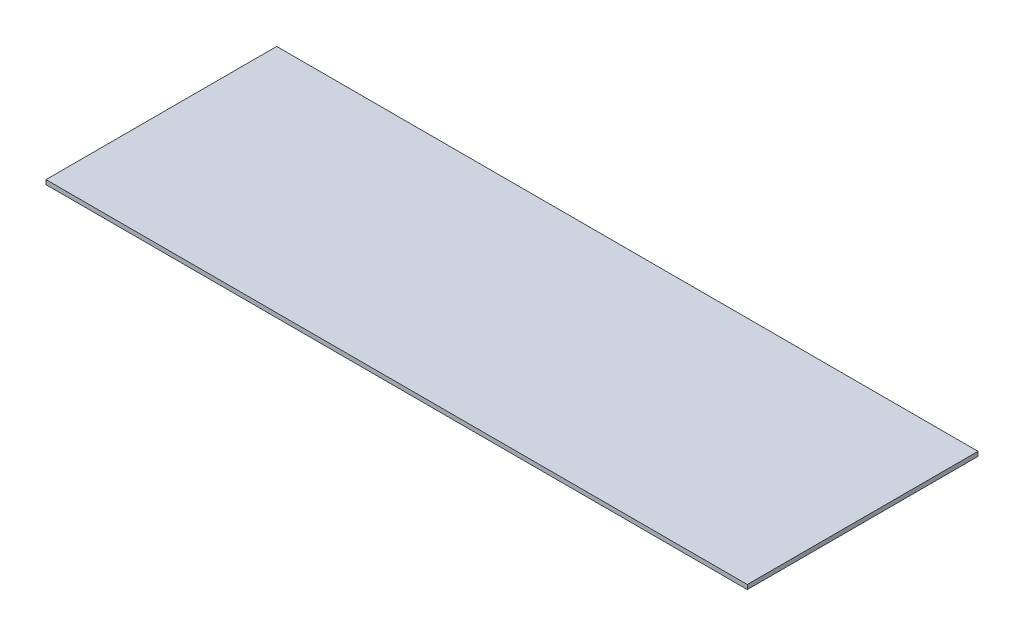
ISO-10303-21;
HEADER;
FILE_DESCRIPTION(('STEP AP214'),'2;1');
FILE_NAME('part.step','',(''),(''),'','','');
FILE_SCHEMA(('AUTOMOTIVE_DESIGN { 1 0 10303 214 1 1 1 1 }'));
ENDSEC;
DATA;
#1=APPLICATION_CONTEXT('core data for automotive mechanical design processes');
#2=APPLICATION_PROTOCOL_DEFINITION('international standard','automotive_design',2000,#1);
#3=PRODUCT_CONTEXT('',#1,'mechanical');
#4=PRODUCT('Part','Part','',(#3));
#5=PRODUCT_RELATED_PRODUCT_CATEGORY('part','',(#4));
#6=PRODUCT_DEFINITION_FORMATION('','',#4);
#7=PRODUCT_DEFINITION_CONTEXT('part definition',#1,'design');
#8=PRODUCT_DEFINITION('design','',#6,#7);
#9=PRODUCT_DEFINITION_SHAPE('','',#8);
#10=(LENGTH_UNIT() NAMED_UNIT(*) SI_UNIT(.MILLI.,.METRE.));
#11=(NAMED_UNIT(*) PLANE_ANGLE_UNIT() SI_UNIT($,.RADIAN.));
#12=(NAMED_UNIT(*) SI_UNIT($,.STERADIAN.) SOLID_ANGLE_UNIT());
#13=UNCERTAINTY_MEASURE_WITH_UNIT(LENGTH_MEASURE(1.E-05),#10,'distance_accuracy_value','');
#14=(GEOMETRIC_REPRESENTATION_CONTEXT(3) GLOBAL_UNCERTAINTY_ASSIGNED_CONTEXT((#13)) GLOBAL_UNIT_ASSIGNED_CONTEXT((#10,
#11,#12)) REPRESENTATION_CONTEXT('',''));
#15=CARTESIAN_POINT('',(0.,0.,0.));
#16=DIRECTION('',(0.,0.,1.));
#17=DIRECTION('',(1.,0.,0.));
#18=AXIS2_PLACEMENT_3D('',#15,#16,#17);
#19=CARTESIAN_POINT('',(0.,1.27,0.));
#20=DIRECTION('',(1.,0.,0.));
#21=DIRECTION('',(0.,0.,-1.));
#22=AXIS2_PLACEMENT_3D('',#19,#20,#21);
#23=PLANE('',#22);
#24=DIRECTION('',(0.,0.,1.));
#25=VECTOR('',#24,1.);
#26=CARTESIAN_POINT('',(0.,0.,0.));
#27=LINE('',#26,#25);
#28=CARTESIAN_POINT('',(0.,0.,-66.675));
#29=VERTEX_POINT('',#28);
#30=CARTESIAN_POINT('',(0.,0.,0.));
#31=VERTEX_POINT('',#30);
#32=EDGE_CURVE('E101',#29,#31,#27,.T.);
#33=ORIENTED_EDGE('',*,*,#32,.T.);
#34=DIRECTION('',(0.,-1.,0.));
#35=VECTOR('',#34,1.);
#36=CARTESIAN_POINT('',(0.,1.27,0.));
#37=LINE('',#36,#35);
#38=CARTESIAN_POINT('',(0.,1.27,0.));
#39=VERTEX_POINT('',#38);
#40=EDGE_CURVE('E11',#39,#31,#37,.T.);
#41=ORIENTED_EDGE('',*,*,#40,.F.);
#42=DIRECTION('',(0.,0.,1.));
#43=VECTOR('',#42,1.);
#44=CARTESIAN_POINT('',(0.,1.27,0.));
#45=LINE('',#44,#43);
#46=CARTESIAN_POINT('',(0.,1.27,-66.675));
#47=VERTEX_POINT('',#46);
#48=EDGE_CURVE('E87',#47,#39,#45,.T.);
#49=ORIENTED_EDGE('',*,*,#48,.F.);
#50=DIRECTION('',(0.,-1.,0.));
#51=VECTOR('',#50,1.);
#52=CARTESIAN_POINT('',(0.,1.27,-66.675));
#53=LINE('',#52,#51);
#54=EDGE_CURVE('E97',#47,#29,#53,.T.);
#55=ORIENTED_EDGE('',*,*,#54,.T.);
#56=EDGE_LOOP('',(#33,#41,#49,#55));
#57=FACE_BOUND('',#56,.T.);
#58=ADVANCED_FACE('F36',(#57),#23,.F.);
#59=CARTESIAN_POINT('',(0.,1.27,0.));
#60=DIRECTION('',(0.,0.,-1.));
#61=DIRECTION('',(-1.,0.,0.));
#62=AXIS2_PLACEMENT_3D('',#59,#60,#61);
#63=PLANE('',#62);
#64=DIRECTION('',(1.,0.,0.));
#65=VECTOR('',#64,1.);
#66=CARTESIAN_POINT('',(0.,0.,0.));
#67=LINE('',#66,#65);
#68=CARTESIAN_POINT('',(202.692,0.,0.));
#69=VERTEX_POINT('',#68);
#70=EDGE_CURVE('E92',#31,#69,#67,.T.);
#71=ORIENTED_EDGE('',*,*,#70,.T.);
#72=DIRECTION('',(0.,-1.,0.));
#73=VECTOR('',#72,1.);
#74=CARTESIAN_POINT('',(202.692,1.27,0.));
#75=LINE('',#74,#73);
#76=CARTESIAN_POINT('',(202.692,1.27,0.));
#77=VERTEX_POINT('',#76);
#78=EDGE_CURVE('E44',#77,#69,#75,.T.);
#79=ORIENTED_EDGE('',*,*,#78,.F.);
#80=DIRECTION('',(1.,0.,0.));
#81=VECTOR('',#80,1.);
#82=CARTESIAN_POINT('',(0.,1.27,0.));
#83=LINE('',#82,#81);
#84=EDGE_CURVE('E82',#39,#77,#83,.T.);
#85=ORIENTED_EDGE('',*,*,#84,.F.);
#86=ORIENTED_EDGE('',*,*,#40,.T.);
#87=EDGE_LOOP('',(#71,#79,#85,#86));
#88=FACE_BOUND('',#87,.T.);
#89=ADVANCED_FACE('F91',(#88),#63,.F.);
#90=CARTESIAN_POINT('',(202.692,1.27,0.));
#91=DIRECTION('',(-1.,0.,0.));
#92=DIRECTION('',(0.,0.,1.));
#93=AXIS2_PLACEMENT_3D('',#90,#91,#92);
#94=PLANE('',#93);
#95=DIRECTION('',(0.,0.,-1.));
#96=VECTOR('',#95,1.);
#97=CARTESIAN_POINT('',(202.692,0.,0.));
#98=LINE('',#97,#96);
#99=CARTESIAN_POINT('',(202.692,0.,-66.675));
#100=VERTEX_POINT('',#99);
#101=EDGE_CURVE('E69',#69,#100,#98,.T.);
#102=ORIENTED_EDGE('',*,*,#101,.T.);
#103=DIRECTION('',(0.,-1.,0.));
#104=VECTOR('',#103,1.);
#105=CARTESIAN_POINT('',(202.692,1.27,-66.675));
#106=LINE('',#105,#104);
#107=CARTESIAN_POINT('',(202.692,1.27,-66.675));
#108=VERTEX_POINT('',#107);
#109=EDGE_CURVE('E93',#108,#100,#106,.T.);
#110=ORIENTED_EDGE('',*,*,#109,.F.);
#111=DIRECTION('',(0.,0.,-1.));
#112=VECTOR('',#111,1.);
#113=CARTESIAN_POINT('',(202.692,1.27,0.));
#114=LINE('',#113,#112);
#115=EDGE_CURVE('E85',#77,#108,#114,.T.);
#116=ORIENTED_EDGE('',*,*,#115,.F.);
#117=ORIENTED_EDGE('',*,*,#78,.T.);
#118=EDGE_LOOP('',(#102,#110,#116,#117));
#119=FACE_BOUND('',#118,.T.);
#120=ADVANCED_FACE('F94',(#119),#94,.F.);
#121=CARTESIAN_POINT('',(0.,1.27,-66.675));
#122=DIRECTION('',(0.,0.,1.));
#123=DIRECTION('',(1.,0.,0.));
#124=AXIS2_PLACEMENT_3D('',#121,#122,#123);
#125=PLANE('',#124);
#126=DIRECTION('',(-1.,0.,0.));
#127=VECTOR('',#126,1.);
#128=CARTESIAN_POINT('',(0.,0.,-66.675));
#129=LINE('',#128,#127);
#130=EDGE_CURVE('E75',#100,#29,#129,.T.);
#131=ORIENTED_EDGE('',*,*,#130,.T.);
#132=ORIENTED_EDGE('',*,*,#54,.F.);
#133=DIRECTION('',(-1.,0.,0.));
#134=VECTOR('',#133,1.);
#135=CARTESIAN_POINT('',(0.,1.27,-66.675));
#136=LINE('',#135,#134);
#137=EDGE_CURVE('E52',#108,#47,#136,.T.);
#138=ORIENTED_EDGE('',*,*,#137,.F.);
#139=ORIENTED_EDGE('',*,*,#109,.T.);
#140=EDGE_LOOP('',(#131,#132,#138,#139));
#141=FACE_BOUND('',#140,.T.);
#142=ADVANCED_FACE('F111',(#141),#125,.F.);
#143=CARTESIAN_POINT('',(0.,1.27,0.));
#144=DIRECTION('',(0.,-1.,0.));
#145=DIRECTION('',(0.,0.,-1.));
#146=AXIS2_PLACEMENT_3D('',#143,#144,#145);
#147=PLANE('',#146);
#148=ORIENTED_EDGE('',*,*,#48,.T.);
#149=ORIENTED_EDGE('',*,*,#84,.T.);
#150=ORIENTED_EDGE('',*,*,#115,.T.);
#151=ORIENTED_EDGE('',*,*,#137,.T.);
#152=EDGE_LOOP('',(#148,#149,#150,#151));
#153=FACE_BOUND('',#152,.T.);
#154=ADVANCED_FACE('F83',(#153),#147,.F.);
#155=CARTESIAN_POINT('',(0.,0.,0.));
#156=DIRECTION('',(0.,-1.,0.));
#157=DIRECTION('',(0.,0.,-1.));
#158=AXIS2_PLACEMENT_3D('',#155,#156,#157);
#159=PLANE('',#158);
#160=ORIENTED_EDGE('',*,*,#32,.F.);
#161=ORIENTED_EDGE('',*,*,#130,.F.);
#162=ORIENTED_EDGE('',*,*,#101,.F.);
#163=ORIENTED_EDGE('',*,*,#70,.F.);
#164=EDGE_LOOP('',(#160,#161,#162,#163));
#165=FACE_BOUND('',#164,.T.);
#166=ADVANCED_FACE('F114',(#165),#159,.T.);
#167=CLOSED_SHELL('',(#58,#89,#120,#142,#154,#166));
#168=MANIFOLD_SOLID_BREP('B2',#167);
#169=ADVANCED_BREP_SHAPE_REPRESENTATION('',(#18,#168),#14);
#170=SHAPE_DEFINITION_REPRESENTATION(#9,#169);
ENDSEC;
END-ISO-10303-21;
